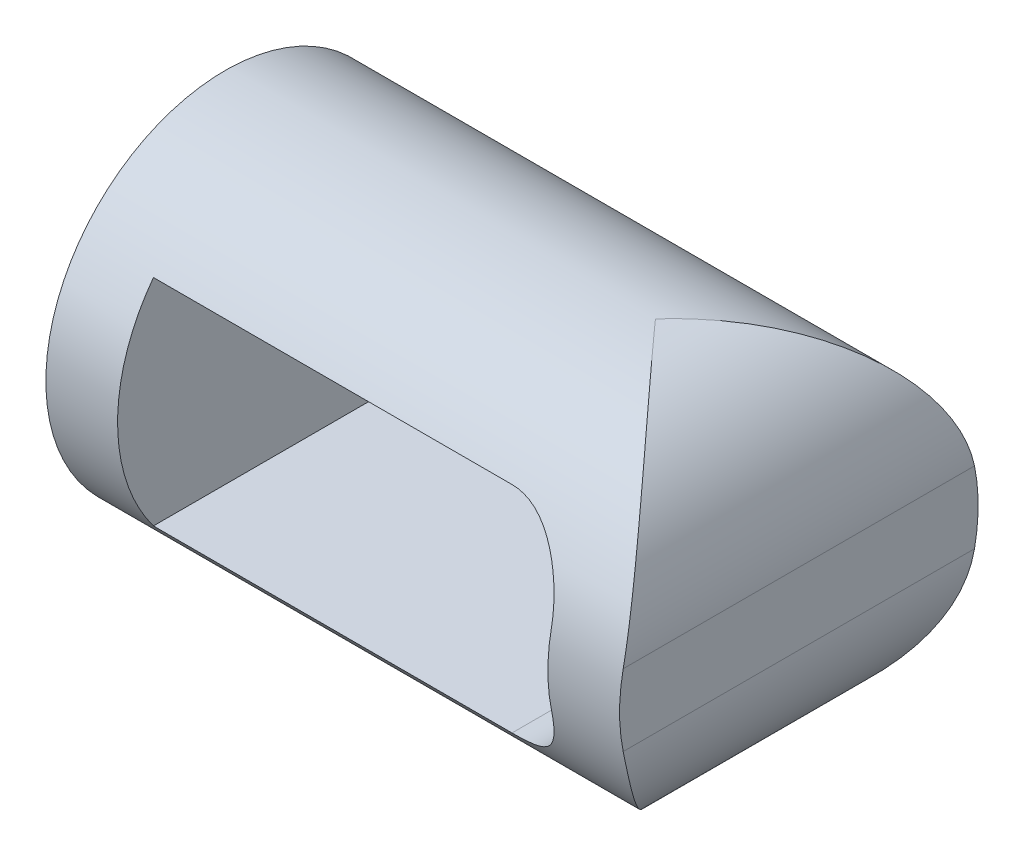
ISO-10303-21;
HEADER;
FILE_DESCRIPTION(('STEP AP214'),'2;1');
FILE_NAME('part.step','',(''),(''),'','','');
FILE_SCHEMA(('AUTOMOTIVE_DESIGN { 1 0 10303 214 1 1 1 1 }'));
ENDSEC;
DATA;
#1=APPLICATION_CONTEXT('core data for automotive mechanical design processes');
#2=APPLICATION_PROTOCOL_DEFINITION('international standard','automotive_design',2000,#1);
#3=PRODUCT_CONTEXT('',#1,'mechanical');
#4=PRODUCT('Part','Part','',(#3));
#5=PRODUCT_RELATED_PRODUCT_CATEGORY('part','',(#4));
#6=PRODUCT_DEFINITION_FORMATION('','',#4);
#7=PRODUCT_DEFINITION_CONTEXT('part definition',#1,'design');
#8=PRODUCT_DEFINITION('design','',#6,#7);
#9=PRODUCT_DEFINITION_SHAPE('','',#8);
#10=(LENGTH_UNIT() NAMED_UNIT(*) SI_UNIT(.MILLI.,.METRE.));
#11=(NAMED_UNIT(*) PLANE_ANGLE_UNIT() SI_UNIT($,.RADIAN.));
#12=(NAMED_UNIT(*) SI_UNIT($,.STERADIAN.) SOLID_ANGLE_UNIT());
#13=UNCERTAINTY_MEASURE_WITH_UNIT(LENGTH_MEASURE(1.E-05),#10,'distance_accuracy_value','');
#14=(GEOMETRIC_REPRESENTATION_CONTEXT(3) GLOBAL_UNCERTAINTY_ASSIGNED_CONTEXT((#13)) GLOBAL_UNIT_ASSIGNED_CONTEXT((#10,
#11,#12)) REPRESENTATION_CONTEXT('',''));
#15=CARTESIAN_POINT('',(0.,0.,0.));
#16=DIRECTION('',(0.,0.,1.));
#17=DIRECTION('',(1.,0.,0.));
#18=AXIS2_PLACEMENT_3D('',#15,#16,#17);
#19=CARTESIAN_POINT('',(40.,0.,0.));
#20=DIRECTION('',(-1.,0.,0.));
#21=DIRECTION('',(0.,0.,1.));
#22=AXIS2_PLACEMENT_3D('',#19,#20,#21);
#23=CYLINDRICAL_SURFACE('',#22,12.5);
#24=CARTESIAN_POINT('',(5.,0.,0.));
#25=DIRECTION('',(1.,0.,0.));
#26=DIRECTION('',(0.,0.,-1.));
#27=AXIS2_PLACEMENT_3D('',#24,#25,#26);
#28=CIRCLE('',#27,12.5);
#29=CARTESIAN_POINT('',(5.,7.5,10.));
#30=VERTEX_POINT('',#29);
#31=CARTESIAN_POINT('',(5.,-7.5,10.));
#32=VERTEX_POINT('',#31);
#33=EDGE_CURVE('E175',#30,#32,#28,.T.);
#34=ORIENTED_EDGE('',*,*,#33,.F.);
#35=DIRECTION('',(-1.,0.,0.));
#36=VECTOR('',#35,1.);
#37=CARTESIAN_POINT('',(40.,7.5,10.));
#38=LINE('',#37,#36);
#39=CARTESIAN_POINT('',(30.,7.5,10.));
#40=VERTEX_POINT('',#39);
#41=EDGE_CURVE('E231',#40,#30,#38,.T.);
#42=ORIENTED_EDGE('',*,*,#41,.F.);
#43=CARTESIAN_POINT('',(35.,2.5,12.2474487139159));
#44=CARTESIAN_POINT('',(35.0000173108513,2.64304263964975,12.2182744647754));
#45=CARTESIAN_POINT('',(34.9938627064975,2.78552844624909,12.1865559325942));
#46=CARTESIAN_POINT('',(34.9696227152255,3.06826211512575,12.1184463564197));
#47=CARTESIAN_POINT('',(34.9515448286343,3.20851132756378,12.082058261392));
#48=CARTESIAN_POINT('',(34.9039861170737,3.48515633374348,12.0051751495393));
#49=CARTESIAN_POINT('',(34.8745611125683,3.62156753713345,11.9647009422692));
#50=CARTESIAN_POINT('',(34.8048088684089,3.8903633491403,11.8800237231488));
#51=CARTESIAN_POINT('',(34.7644801133342,4.02274739520904,11.8358201935794));
#52=CARTESIAN_POINT('',(34.6281028468935,4.41208190303809,11.6986689981954));
#53=CARTESIAN_POINT('',(34.5165085153691,4.66208884780586,11.6009337054515));
#54=CARTESIAN_POINT('',(34.2557979703201,5.13860273294414,11.3979020362314));
#55=CARTESIAN_POINT('',(34.1066196834968,5.36506991250965,11.2925933592719));
#56=CARTESIAN_POINT('',(33.7605348056083,5.80812739328812,11.0716644354255));
#57=CARTESIAN_POINT('',(33.5607180263125,6.02238595046168,10.9559065984226));
#58=CARTESIAN_POINT('',(33.1247091819133,6.41435144079428,10.7311301527593));
#59=CARTESIAN_POINT('',(32.8885270398023,6.59206831425582,10.6221097170072));
#60=CARTESIAN_POINT('',(32.4234488092273,6.88054775875883,10.4370799173079));
#61=CARTESIAN_POINT('',(32.1994121837499,6.99747034027596,10.3585791372034));
#62=CARTESIAN_POINT('',(31.8487374182665,7.14740003987351,10.2551623196672));
#63=CARTESIAN_POINT('',(31.7295123090405,7.19310732901987,10.2230994169672));
#64=CARTESIAN_POINT('',(31.4867004479111,7.2755766096283,10.1645729633264));
#65=CARTESIAN_POINT('',(31.3631161663763,7.31234357724589,10.1381062986118));
#66=CARTESIAN_POINT('',(31.1380549197897,7.36984845904019,10.09635201108));
#67=CARTESIAN_POINT('',(31.0372367394838,7.39232710187402,10.0798849791753));
#68=CARTESIAN_POINT('',(30.8338116365539,7.43107241030281,10.0513550947375));
#69=CARTESIAN_POINT('',(30.731205117396,7.44734045857258,10.0392912619394));
#70=CARTESIAN_POINT('',(30.5241919408818,7.47354551079658,10.019800493881));
#71=CARTESIAN_POINT('',(30.4197786430372,7.48344866718375,10.0123983529423));
#72=CARTESIAN_POINT('',(30.2102473279902,7.49668496536224,10.0024860173858));
#73=CARTESIAN_POINT('',(30.1051289438324,7.50001436813701,9.99997860679958));
#74=CARTESIAN_POINT('',(30.,7.5,10.));
#75=B_SPLINE_CURVE_WITH_KNOTS('',3,(#43,#44,#45,#46,#47,#48,#49,#50,#51,#52,#53,#54,#55,#56,#57,
#58,#59,#60,#61,#62,#63,#64,#65,#66,#67,#68,#69,#70,#71,#72,#73,#74),.UNSPECIFIED.,.F.,.F.,(4,2,
2,2,2,2,2,2,2,2,2,2,2,2,2,4),(0.,0.437753426293644,0.875231746594388,1.31058485962215,
1.74599850985513,2.61409497073356,3.4836346795091,4.42445953030344,5.36502811232595,
6.1553956877774,6.54993683038406,6.94425786733992,7.25778238313815,7.57123705769995,
7.88634514009734,8.20163239795346),.UNSPECIFIED.);
#76=CARTESIAN_POINT('',(35.,2.5,12.2474487139159));
#77=VERTEX_POINT('',#76);
#78=EDGE_CURVE('E225',#77,#40,#75,.T.);
#79=ORIENTED_EDGE('',*,*,#78,.F.);
#80=CARTESIAN_POINT('',(35.,0.,0.));
#81=DIRECTION('',(-1.,0.,0.));
#82=DIRECTION('',(0.,0.,1.));
#83=AXIS2_PLACEMENT_3D('',#80,#81,#82);
#84=CIRCLE('',#83,12.5);
#85=CARTESIAN_POINT('',(35.,-2.49999999999997,12.2474487139159));
#86=VERTEX_POINT('',#85);
#87=EDGE_CURVE('E171',#86,#77,#84,.T.);
#88=ORIENTED_EDGE('',*,*,#87,.F.);
#89=CARTESIAN_POINT('',(35.,-2.49999999999997,12.2474487139159));
#90=CARTESIAN_POINT('',(35.0000173108513,-2.64304263964971,12.2182744647754));
#91=CARTESIAN_POINT('',(34.9938627064975,-2.78552844624906,12.1865559325942));
#92=CARTESIAN_POINT('',(34.9696227152255,-3.06826211512571,12.1184463564197));
#93=CARTESIAN_POINT('',(34.9515448286343,-3.20851132756375,12.082058261392));
#94=CARTESIAN_POINT('',(34.9039861170737,-3.48515633374345,12.0051751495393));
#95=CARTESIAN_POINT('',(34.8745611125683,-3.62156753713341,11.9647009422692));
#96=CARTESIAN_POINT('',(34.804808868409,-3.89036334914026,11.8800237231489));
#97=CARTESIAN_POINT('',(34.7644801133343,-4.022747395209,11.8358201935794));
#98=CARTESIAN_POINT('',(34.6281028468935,-4.41208190303806,11.6986689981954));
#99=CARTESIAN_POINT('',(34.5165085153691,-4.66208884780584,11.6009337054515));
#100=CARTESIAN_POINT('',(34.2557979703202,-5.13860273294411,11.3979020362315));
#101=CARTESIAN_POINT('',(34.1066196834968,-5.36506991250962,11.292593359272));
#102=CARTESIAN_POINT('',(33.7605348056084,-5.8081273932881,11.0716644354255));
#103=CARTESIAN_POINT('',(33.5607180263126,-6.02238595046165,10.9559065984226));
#104=CARTESIAN_POINT('',(33.1247091819133,-6.41435144079425,10.7311301527593));
#105=CARTESIAN_POINT('',(32.8885270398023,-6.5920683142558,10.6221097170072));
#106=CARTESIAN_POINT('',(32.4234488092274,-6.88054775875881,10.4370799173079));
#107=CARTESIAN_POINT('',(32.19941218375,-6.99747034027594,10.3585791372034));
#108=CARTESIAN_POINT('',(31.8487374182665,-7.1474000398735,10.2551623196672));
#109=CARTESIAN_POINT('',(31.7295123090405,-7.19310732901985,10.2230994169672));
#110=CARTESIAN_POINT('',(31.4867004479111,-7.27557660962829,10.1645729633264));
#111=CARTESIAN_POINT('',(31.3631161663764,-7.31234357724588,10.1381062986118));
#112=CARTESIAN_POINT('',(31.1380549197897,-7.36984845904019,10.09635201108));
#113=CARTESIAN_POINT('',(31.0372367394838,-7.39232710187401,10.0798849791753));
#114=CARTESIAN_POINT('',(30.8338116365539,-7.4310724103028,10.0513550947375));
#115=CARTESIAN_POINT('',(30.731205117396,-7.44734045857258,10.0392912619394));
#116=CARTESIAN_POINT('',(30.5241919408818,-7.47354551079658,10.019800493881));
#117=CARTESIAN_POINT('',(30.4197786430372,-7.48344866718375,10.0123983529423));
#118=CARTESIAN_POINT('',(30.2102473279901,-7.49668496536224,10.0024860173858));
#119=CARTESIAN_POINT('',(30.1051289438324,-7.50001436813701,9.99997860679958));
#120=CARTESIAN_POINT('',(30.,-7.5,10.));
#121=B_SPLINE_CURVE_WITH_KNOTS('',3,(#89,#90,#91,#92,#93,#94,#95,#96,#97,#98,#99,#100,#101,#102,
#103,#104,#105,#106,#107,#108,#109,#110,#111,#112,#113,#114,#115,#116,#117,#118,#119,#120),
.UNSPECIFIED.,.F.,.F.,(4,2,2,2,2,2,2,2,2,2,2,2,2,2,2,4),(0.,0.437753426293642,0.875231746594384,
1.31058485962215,1.74599850985513,2.61409497073357,3.48363467950909,4.42445953030343,
5.36502811232594,6.15539568777739,6.54993683038405,6.94425786733991,7.25778238313816,
7.57123705769998,7.8863451400974,8.20163239795353),.UNSPECIFIED.);
#122=CARTESIAN_POINT('',(30.,-7.5,10.));
#123=VERTEX_POINT('',#122);
#124=EDGE_CURVE('E183',#86,#123,#121,.T.);
#125=ORIENTED_EDGE('',*,*,#124,.T.);
#126=DIRECTION('',(-1.,0.,0.));
#127=VECTOR('',#126,1.);
#128=CARTESIAN_POINT('',(40.,-7.5,10.));
#129=LINE('',#128,#127);
#130=EDGE_CURVE('E179',#123,#32,#129,.T.);
#131=ORIENTED_EDGE('',*,*,#130,.T.);
#132=EDGE_LOOP('',(#34,#42,#79,#88,#125,#131));
#133=FACE_BOUND('',#132,.T.);
#134=CARTESIAN_POINT('',(0.,0.,0.));
#135=DIRECTION('',(1.,0.,0.));
#136=DIRECTION('',(0.,0.,-1.));
#137=AXIS2_PLACEMENT_3D('',#134,#135,#136);
#138=CIRCLE('',#137,12.5);
#139=CARTESIAN_POINT('',(0.,0.,-12.5));
#140=VERTEX_POINT('',#139);
#141=EDGE_CURVE('E155',#140,#140,#138,.T.);
#142=ORIENTED_EDGE('',*,*,#141,.T.);
#143=EDGE_LOOP('',(#142));
#144=FACE_BOUND('',#143,.T.);
#145=DIRECTION('',(-1.,0.,0.));
#146=VECTOR('',#145,1.);
#147=CARTESIAN_POINT('',(40.,7.5,-10.));
#148=LINE('',#147,#146);
#149=CARTESIAN_POINT('',(5.,7.5,-10.));
#150=VERTEX_POINT('',#149);
#151=CARTESIAN_POINT('',(30.,7.5,-10.));
#152=VERTEX_POINT('',#151);
#153=EDGE_CURVE('E217',#150,#152,#148,.F.);
#154=ORIENTED_EDGE('',*,*,#153,.F.);
#155=CARTESIAN_POINT('',(5.,-7.5,-10.));
#156=VERTEX_POINT('',#155);
#157=EDGE_CURVE('E180',#156,#150,#28,.T.);
#158=ORIENTED_EDGE('',*,*,#157,.F.);
#159=DIRECTION('',(-1.,0.,0.));
#160=VECTOR('',#159,1.);
#161=CARTESIAN_POINT('',(40.,-7.5,-10.));
#162=LINE('',#161,#160);
#163=CARTESIAN_POINT('',(30.,-7.5,-10.));
#164=VERTEX_POINT('',#163);
#165=EDGE_CURVE('E191',#156,#164,#162,.F.);
#166=ORIENTED_EDGE('',*,*,#165,.T.);
#167=CARTESIAN_POINT('',(30.,-7.5,-10.));
#168=CARTESIAN_POINT('',(30.1247204693742,-7.50002718708944,-9.99995899400171));
#169=CARTESIAN_POINT('',(30.2494152129274,-7.49533447378452,-10.0034987559836));
#170=CARTESIAN_POINT('',(30.4976304337379,-7.47672263245428,-10.0174279416072));
#171=CARTESIAN_POINT('',(30.6211517837259,-7.46281101308754,-10.0278117908072));
#172=CARTESIAN_POINT('',(30.8651870607509,-7.42611195382512,-10.0550160327823));
#173=CARTESIAN_POINT('',(30.9857165766035,-7.40339171760391,-10.0717876744305));
#174=CARTESIAN_POINT('',(31.2238543588848,-7.3494435771701,-10.1112212887111));
#175=CARTESIAN_POINT('',(31.3414621628741,-7.31821433542279,-10.1338841873673));
#176=CARTESIAN_POINT('',(31.6880630063489,-7.21259470087898,-10.2096031889185));
#177=CARTESIAN_POINT('',(31.9117927579268,-7.12612369339366,-10.2705047596072));
#178=CARTESIAN_POINT('',(32.3410770407231,-6.92446188467155,-10.4075281418579));
#179=CARTESIAN_POINT('',(32.5465949241225,-6.80921487920687,-10.4836796807873));
#180=CARTESIAN_POINT('',(32.9579899574613,-6.5394483316558,-10.6542826991711));
#181=CARTESIAN_POINT('',(33.1615107031403,-6.38203223564422,-10.7498222582702));
#182=CARTESIAN_POINT('',(33.5409575749913,-6.03935031693989,-10.9460127206075));
#183=CARTESIAN_POINT('',(33.7168677433811,-5.85406850924902,-11.0466665355199));
#184=CARTESIAN_POINT('',(33.9709467976543,-5.54194198186121,-11.2050638316715));
#185=CARTESIAN_POINT('',(34.0591353515685,-5.42323956627597,-11.2630733904142));
#186=CARTESIAN_POINT('',(34.2248904373856,-5.17809212682015,-11.3778578260909));
#187=CARTESIAN_POINT('',(34.3024602110048,-5.05164948303285,-11.4346330753644));
#188=CARTESIAN_POINT('',(34.4463559691219,-4.79171870985679,-11.5459696717059));
#189=CARTESIAN_POINT('',(34.5126892655615,-4.65823523691382,-11.6005324407848));
#190=CARTESIAN_POINT('',(34.6335097103042,-4.38491258464052,-11.7065797246787));
#191=CARTESIAN_POINT('',(34.6880031238864,-4.24507681433904,-11.7580658570405));
#192=CARTESIAN_POINT('',(34.779067644612,-3.97592597750572,-11.8515805156562));
#193=CARTESIAN_POINT('',(34.8169667022358,-3.84720222848403,-11.8940208810842));
#194=CARTESIAN_POINT('',(34.8824729141968,-3.58608179285811,-11.9753379007698));
#195=CARTESIAN_POINT('',(34.9100822264228,-3.45368588261661,-12.0142153009349));
#196=CARTESIAN_POINT('',(34.9546507101497,-3.18553472687917,-12.0880822999534));
#197=CARTESIAN_POINT('',(34.9715730096907,-3.04976951260877,-12.1230580996838));
#198=CARTESIAN_POINT('',(34.994259358269,-2.77617557228172,-12.1886338213263));
#199=CARTESIAN_POINT('',(35.0000161939026,-2.63834557017233,-12.219230902572));
#200=CARTESIAN_POINT('',(35.,-2.49999999999997,-12.2474487139159));
#201=B_SPLINE_CURVE_WITH_KNOTS('',3,(#167,#168,#169,#170,#171,#172,#173,#174,#175,#176,#177,
#178,#179,#180,#181,#182,#183,#184,#185,#186,#187,#188,#189,#190,#191,#192,#193,#194,#195,#196,
#197,#198,#199,#200),.UNSPECIFIED.,.F.,.F.,(4,2,2,2,2,2,2,2,2,2,2,2,2,2,2,2,4),(0.,
0.373981117624396,0.747658007090969,1.11853838755862,1.48947710055967,2.2284595050888,
2.96889671075211,3.78926824402105,4.61011218624194,5.08618334638943,5.56210884518987,
6.03772344402542,6.51308574686093,6.93485421040295,7.35653417396105,7.77966116721225,
8.20306142904119),.UNSPECIFIED.);
#202=CARTESIAN_POINT('',(35.,-2.49999999999997,-12.2474487139159));
#203=VERTEX_POINT('',#202);
#204=EDGE_CURVE('E203',#164,#203,#201,.T.);
#205=ORIENTED_EDGE('',*,*,#204,.T.);
#206=CARTESIAN_POINT('',(35.,2.5,-12.2474487139159));
#207=VERTEX_POINT('',#206);
#208=EDGE_CURVE('E176',#207,#203,#84,.T.);
#209=ORIENTED_EDGE('',*,*,#208,.F.);
#210=CARTESIAN_POINT('',(30.,7.5,-10.));
#211=CARTESIAN_POINT('',(30.1247204693742,7.50002718708944,-9.99995899400171));
#212=CARTESIAN_POINT('',(30.2494152129274,7.49533447378452,-10.0034987559836));
#213=CARTESIAN_POINT('',(30.4976304337379,7.47672263245427,-10.0174279416072));
#214=CARTESIAN_POINT('',(30.6211517837259,7.46281101308753,-10.0278117908072));
#215=CARTESIAN_POINT('',(30.8651870607509,7.42611195382512,-10.0550160327823));
#216=CARTESIAN_POINT('',(30.9857165766035,7.4033917176039,-10.0717876744305));
#217=CARTESIAN_POINT('',(31.2238543588848,7.34944357717009,-10.1112212887111));
#218=CARTESIAN_POINT('',(31.3414621628742,7.31821433542278,-10.1338841873673));
#219=CARTESIAN_POINT('',(31.688063006349,7.21259470087896,-10.2096031889185));
#220=CARTESIAN_POINT('',(31.9117927579268,7.12612369339364,-10.2705047596073));
#221=CARTESIAN_POINT('',(32.3410770407231,6.92446188467153,-10.4075281418579));
#222=CARTESIAN_POINT('',(32.5465949241226,6.80921487920684,-10.4836796807874));
#223=CARTESIAN_POINT('',(32.9579899574613,6.53944833165577,-10.6542826991711));
#224=CARTESIAN_POINT('',(33.1615107031404,6.38203223564418,-10.7498222582702));
#225=CARTESIAN_POINT('',(33.5409575749913,6.03935031693985,-10.9460127206075));
#226=CARTESIAN_POINT('',(33.7168677433812,5.85406850924898,-11.0466665355199));
#227=CARTESIAN_POINT('',(33.9709467976543,5.54194198186117,-11.2050638316715));
#228=CARTESIAN_POINT('',(34.0591353515686,5.42323956627592,-11.2630733904142));
#229=CARTESIAN_POINT('',(34.2248904373856,5.1780921268201,-11.377857826091));
#230=CARTESIAN_POINT('',(34.3024602110048,5.0516494830328,-11.4346330753644));
#231=CARTESIAN_POINT('',(34.446355969122,4.79171870985673,-11.5459696717059));
#232=CARTESIAN_POINT('',(34.5126892655615,4.65823523691376,-11.6005324407848));
#233=CARTESIAN_POINT('',(34.6335097103043,4.38491258464045,-11.7065797246787));
#234=CARTESIAN_POINT('',(34.6880031238864,4.24507681433898,-11.7580658570405));
#235=CARTESIAN_POINT('',(34.779067644612,3.97592597750566,-11.8515805156563));
#236=CARTESIAN_POINT('',(34.8169667022359,3.84720222848398,-11.8940208810842));
#237=CARTESIAN_POINT('',(34.8824729141968,3.58608179285807,-11.9753379007698));
#238=CARTESIAN_POINT('',(34.9100822264228,3.45368588261658,-12.0142153009349));
#239=CARTESIAN_POINT('',(34.9546507101497,3.18553472687915,-12.0880822999534));
#240=CARTESIAN_POINT('',(34.9715730096907,3.04976951260877,-12.1230580996838));
#241=CARTESIAN_POINT('',(34.994259358269,2.77617557228174,-12.1886338213263));
#242=CARTESIAN_POINT('',(35.0000161939026,2.63834557017235,-12.219230902572));
#243=CARTESIAN_POINT('',(35.,2.5,-12.2474487139159));
#244=B_SPLINE_CURVE_WITH_KNOTS('',3,(#210,#211,#212,#213,#214,#215,#216,#217,#218,#219,#220,
#221,#222,#223,#224,#225,#226,#227,#228,#229,#230,#231,#232,#233,#234,#235,#236,#237,#238,#239,
#240,#241,#242,#243),.UNSPECIFIED.,.F.,.F.,(4,2,2,2,2,2,2,2,2,2,2,2,2,2,2,2,4),(0.,
0.373981117624393,0.747658007090967,1.11853838755862,1.48947710055968,2.22845950508881,
2.96889671075212,3.78926824402107,4.61011218624196,5.08618334638946,5.56210884518991,
6.03772344402545,6.51308574686096,6.93485421040296,7.35653417396103,7.77966116721221,
8.20306142904111),.UNSPECIFIED.);
#245=EDGE_CURVE('E210',#152,#207,#244,.T.);
#246=ORIENTED_EDGE('',*,*,#245,.F.);
#247=EDGE_LOOP('',(#154,#158,#166,#205,#209,#246));
#248=FACE_BOUND('',#247,.T.);
#249=CARTESIAN_POINT('',(40.,-2.5,12.2474487139159));
#250=CARTESIAN_POINT('',(40.0000016717614,-2.62836492800187,12.2212486348904));
#251=CARTESIAN_POINT('',(39.9975278269961,-2.75629370404988,12.1930302177246));
#252=CARTESIAN_POINT('',(39.9877477677561,-3.01101288582775,12.1326388316596));
#253=CARTESIAN_POINT('',(39.9804421282439,-3.13780342518354,12.1004663336494));
#254=CARTESIAN_POINT('',(39.9514818911527,-3.51575777321372,11.9982272566927));
#255=CARTESIAN_POINT('',(39.9227832916221,-3.76486868655985,11.9223645511743));
#256=CARTESIAN_POINT('',(39.8481892856461,-4.25318493665481,11.7569686480874));
#257=CARTESIAN_POINT('',(39.8024541455063,-4.49246020774166,11.6675673227206));
#258=CARTESIAN_POINT('',(39.6951562142992,-4.96210938665913,11.4757062960274));
#259=CARTESIAN_POINT('',(39.6335891766424,-5.19248088713104,11.3732430948384));
#260=CARTESIAN_POINT('',(39.4964384794338,-5.64207505780995,11.1570120936349));
#261=CARTESIAN_POINT('',(39.420922154275,-5.86134509784488,11.0432997695532));
#262=CARTESIAN_POINT('',(39.2571727841952,-6.28909331280023,10.8054266560405));
#263=CARTESIAN_POINT('',(39.1689407811051,-6.49757236995574,10.6812667229576));
#264=CARTESIAN_POINT('',(38.8867706392496,-7.10716904144928,10.2941716913459));
#265=CARTESIAN_POINT('',(38.6756355649242,-7.49156845696739,10.0170503175293));
#266=CARTESIAN_POINT('',(38.271497867742,-8.12937746668313,9.50210905704535));
#267=CARTESIAN_POINT('',(38.0857620030858,-8.39242141563058,9.27020937745591));
#268=CARTESIAN_POINT('',(37.6970373721113,-8.89184672809907,8.79229528446788));
#269=CARTESIAN_POINT('',(37.4940413229099,-9.12821673775368,8.54627492726254));
#270=CARTESIAN_POINT('',(37.0736373446144,-9.57516746862886,8.04237841813135));
#271=CARTESIAN_POINT('',(36.856203559486,-9.78569988767282,7.78448126408438));
#272=CARTESIAN_POINT('',(36.4098575437241,-10.1813179451211,7.25939452862124));
#273=CARTESIAN_POINT('',(36.1809455932952,-10.3664042043038,6.99220517409465));
#274=CARTESIAN_POINT('',(35.6269671243344,-10.7762372277529,6.34957093762996));
#275=CARTESIAN_POINT('',(35.2977659779117,-10.9901814552208,5.97077737702586));
#276=CARTESIAN_POINT('',(34.6262047623305,-11.3740002065139,5.20255599568804));
#277=CARTESIAN_POINT('',(34.2838388217176,-11.543854798515,4.81312345295705));
#278=CARTESIAN_POINT('',(33.5899154020178,-11.8410301489273,4.02696456262087));
#279=CARTESIAN_POINT('',(33.2383652420209,-11.9683837256222,3.63024409350597));
#280=CARTESIAN_POINT('',(32.5289514273559,-12.1820224965073,2.83178959191918));
#281=CARTESIAN_POINT('',(32.171090655308,-12.2683259625359,2.43005787187767));
#282=CARTESIAN_POINT('',(31.5135128614413,-12.3894375686048,1.693005495995));
#283=CARTESIAN_POINT('',(31.2143951664175,-12.4305540918009,1.35816144339166));
#284=CARTESIAN_POINT('',(30.6151303202857,-12.4855910336129,0.687739896521128));
#285=CARTESIAN_POINT('',(30.3149846826256,-12.4995416245891,0.352163630861815));
#286=CARTESIAN_POINT('',(30.0099380598565,-12.4999962952456,0.0111110886298165));
#287=CARTESIAN_POINT('',(30.004969018897,-12.4999999988764,0.00555553200933672));
#288=CARTESIAN_POINT('',(30.,-12.5,0.));
#289=B_SPLINE_CURVE_WITH_KNOTS('',3,(#249,#250,#251,#252,#253,#254,#255,#256,#257,#258,#259,
#260,#261,#262,#263,#264,#265,#266,#267,#268,#269,#270,#271,#272,#273,#274,#275,#276,#277,#278,
#279,#280,#281,#282,#283,#284,#285,#286,#287,#288),.UNSPECIFIED.,.F.,.F.,(4,2,2,2,2,2,2,2,2,2,2,
2,2,2,2,2,2,2,2,4),(0.,0.392950042319285,0.785853333707199,1.57054881948284,2.3480416366728,
3.12574321867387,3.8997844745557,4.67376234710201,6.22473551524199,7.41376610785693,
8.60330092202695,9.79502669478863,10.9867233893376,12.6210409334166,14.2560960299531,
15.889885638236,17.5229473473761,18.8747935132382,20.2251373670876,20.2474980496234),.UNSPECIFIED.);
#290=CARTESIAN_POINT('',(40.,-2.5,12.2474487139159));
#291=VERTEX_POINT('',#290);
#292=CARTESIAN_POINT('',(29.9999999999999,-12.5,0.));
#293=VERTEX_POINT('',#292);
#294=EDGE_CURVE('E108',#291,#293,#289,.T.);
#295=ORIENTED_EDGE('',*,*,#294,.F.);
#296=CARTESIAN_POINT('',(40.,0.,0.));
#297=DIRECTION('',(1.,0.,0.));
#298=DIRECTION('',(0.,0.,-1.));
#299=AXIS2_PLACEMENT_3D('',#296,#297,#298);
#300=CIRCLE('',#299,12.5);
#301=CARTESIAN_POINT('',(40.,2.5,12.2474487139159));
#302=VERTEX_POINT('',#301);
#303=EDGE_CURVE('E169',#302,#291,#300,.T.);
#304=ORIENTED_EDGE('',*,*,#303,.F.);
#305=CARTESIAN_POINT('',(40.,2.49999999999993,12.2474487139159));
#306=CARTESIAN_POINT('',(40.0000016717614,2.6283649280018,12.2212486348904));
#307=CARTESIAN_POINT('',(39.9975278269961,2.7562937040498,12.1930302177246));
#308=CARTESIAN_POINT('',(39.9877477677561,3.01101288582767,12.1326388316596));
#309=CARTESIAN_POINT('',(39.9804421282439,3.13780342518347,12.1004663336495));
#310=CARTESIAN_POINT('',(39.9514818911527,3.51575777321364,11.9982272566927));
#311=CARTESIAN_POINT('',(39.9227832916221,3.76486868655977,11.9223645511743));
#312=CARTESIAN_POINT('',(39.8481892856461,4.25318493665474,11.7569686480874));
#313=CARTESIAN_POINT('',(39.8024541455063,4.49246020774159,11.6675673227207));
#314=CARTESIAN_POINT('',(39.6951562142992,4.96210938665906,11.4757062960274));
#315=CARTESIAN_POINT('',(39.6335891766424,5.19248088713096,11.3732430948384));
#316=CARTESIAN_POINT('',(39.4964384794338,5.64207505780988,11.157012093635));
#317=CARTESIAN_POINT('',(39.420922154275,5.8613450978448,11.0432997695533));
#318=CARTESIAN_POINT('',(39.2571727841952,6.28909331280016,10.8054266560406));
#319=CARTESIAN_POINT('',(39.1689407811051,6.49757236995567,10.6812667229577));
#320=CARTESIAN_POINT('',(38.8867706392496,7.10716904144921,10.294171691346));
#321=CARTESIAN_POINT('',(38.6756355649242,7.49156845696732,10.0170503175294));
#322=CARTESIAN_POINT('',(38.271497867742,8.12937746668306,9.50210905704541));
#323=CARTESIAN_POINT('',(38.0857620030859,8.39242141563051,9.27020937745597));
#324=CARTESIAN_POINT('',(37.6970373721114,8.891846728099,8.79229528446795));
#325=CARTESIAN_POINT('',(37.4940413229099,9.12821673775361,8.54627492726261));
#326=CARTESIAN_POINT('',(37.0736373446145,9.57516746862879,8.04237841813143));
#327=CARTESIAN_POINT('',(36.8562035594861,9.78569988767275,7.78448126408447));
#328=CARTESIAN_POINT('',(36.4098575437242,10.1813179451211,7.25939452862133));
#329=CARTESIAN_POINT('',(36.1809455932953,10.3664042043038,6.99220517409474));
#330=CARTESIAN_POINT('',(35.6269671243345,10.7762372277528,6.34957093763006));
#331=CARTESIAN_POINT('',(35.2977659779117,10.9901814552207,5.97077737702595));
#332=CARTESIAN_POINT('',(34.6262047623306,11.3740002065138,5.20255599568815));
#333=CARTESIAN_POINT('',(34.2838388217177,11.543854798515,4.81312345295715));
#334=CARTESIAN_POINT('',(33.5899154020179,11.8410301489273,4.02696456262098));
#335=CARTESIAN_POINT('',(33.238365242021,11.9683837256222,3.63024409350608));
#336=CARTESIAN_POINT('',(32.528951427356,12.1820224965073,2.83178959191931));
#337=CARTESIAN_POINT('',(32.1710906553081,12.2683259625359,2.43005787187783));
#338=CARTESIAN_POINT('',(31.5135128614414,12.3894375686048,1.69300549599509));
#339=CARTESIAN_POINT('',(31.2143951664177,12.4305540918009,1.35816144339167));
#340=CARTESIAN_POINT('',(30.6151303202856,12.4855910336129,0.687739896521252));
#341=CARTESIAN_POINT('',(30.3149846826253,12.4995416245891,0.352163630862123));
#342=CARTESIAN_POINT('',(30.0099380598565,12.4999962952456,0.0111110886298247));
#343=CARTESIAN_POINT('',(30.004969018897,12.4999999988764,0.00555553200934091));
#344=CARTESIAN_POINT('',(30.,12.5,0.));
#345=B_SPLINE_CURVE_WITH_KNOTS('',3,(#305,#306,#307,#308,#309,#310,#311,#312,#313,#314,#315,
#316,#317,#318,#319,#320,#321,#322,#323,#324,#325,#326,#327,#328,#329,#330,#331,#332,#333,#334,
#335,#336,#337,#338,#339,#340,#341,#342,#343,#344),.UNSPECIFIED.,.F.,.F.,(4,2,2,2,2,2,2,2,2,2,2,
2,2,2,2,2,2,2,2,4),(0.,0.392950042319284,0.785853333707196,1.57054881948283,2.34804163667279,
3.12574321867385,3.89978447455568,4.673762347102,6.22473551524196,7.4137661078569,
8.6033009220269,9.79502669478857,10.9867233893375,12.6210409334165,14.256096029953,
15.8898856382359,17.522947347376,18.8747935132382,20.2251373670877,20.2474980496235),.UNSPECIFIED.);
#346=CARTESIAN_POINT('',(29.9999999999999,12.5,0.));
#347=VERTEX_POINT('',#346);
#348=EDGE_CURVE('E61',#347,#302,#345,.F.);
#349=ORIENTED_EDGE('',*,*,#348,.F.);
#350=CARTESIAN_POINT('',(40.,2.49999999999993,-12.2474487139159));
#351=CARTESIAN_POINT('',(40.0000016717614,2.6283649280018,-12.2212486348904));
#352=CARTESIAN_POINT('',(39.9975278269961,2.7562937040498,-12.1930302177246));
#353=CARTESIAN_POINT('',(39.9877477677561,3.01101288582767,-12.1326388316596));
#354=CARTESIAN_POINT('',(39.9804421282439,3.13780342518347,-12.1004663336495));
#355=CARTESIAN_POINT('',(39.9514818911527,3.51575777321364,-11.9982272566927));
#356=CARTESIAN_POINT('',(39.9227832916221,3.76486868655977,-11.9223645511743));
#357=CARTESIAN_POINT('',(39.8481892856461,4.25318493665474,-11.7569686480874));
#358=CARTESIAN_POINT('',(39.8024541455063,4.49246020774159,-11.6675673227207));
#359=CARTESIAN_POINT('',(39.6951562142992,4.96210938665906,-11.4757062960274));
#360=CARTESIAN_POINT('',(39.6335891766424,5.19248088713096,-11.3732430948384));
#361=CARTESIAN_POINT('',(39.4964384794338,5.64207505780988,-11.157012093635));
#362=CARTESIAN_POINT('',(39.420922154275,5.8613450978448,-11.0432997695533));
#363=CARTESIAN_POINT('',(39.2571727841952,6.28909331280016,-10.8054266560406));
#364=CARTESIAN_POINT('',(39.1689407811051,6.49757236995567,-10.6812667229577));
#365=CARTESIAN_POINT('',(38.8867706392496,7.10716904144921,-10.294171691346));
#366=CARTESIAN_POINT('',(38.6756355649242,7.49156845696732,-10.0170503175294));
#367=CARTESIAN_POINT('',(38.271497867742,8.12937746668306,-9.50210905704541));
#368=CARTESIAN_POINT('',(38.0857620030859,8.39242141563051,-9.27020937745597));
#369=CARTESIAN_POINT('',(37.6970373721114,8.891846728099,-8.79229528446795));
#370=CARTESIAN_POINT('',(37.4940413229099,9.12821673775361,-8.54627492726261));
#371=CARTESIAN_POINT('',(37.0736373446145,9.57516746862879,-8.04237841813143));
#372=CARTESIAN_POINT('',(36.8562035594861,9.78569988767275,-7.78448126408447));
#373=CARTESIAN_POINT('',(36.4098575437242,10.1813179451211,-7.25939452862133));
#374=CARTESIAN_POINT('',(36.1809455932953,10.3664042043038,-6.99220517409474));
#375=CARTESIAN_POINT('',(35.6269671243345,10.7762372277528,-6.34957093763006));
#376=CARTESIAN_POINT('',(35.2977659779117,10.9901814552207,-5.97077737702595));
#377=CARTESIAN_POINT('',(34.6262047623306,11.3740002065138,-5.20255599568815));
#378=CARTESIAN_POINT('',(34.2838388217177,11.543854798515,-4.81312345295715));
#379=CARTESIAN_POINT('',(33.5899154020179,11.8410301489273,-4.02696456262098));
#380=CARTESIAN_POINT('',(33.238365242021,11.9683837256222,-3.63024409350608));
#381=CARTESIAN_POINT('',(32.528951427356,12.1820224965073,-2.83178959191931));
#382=CARTESIAN_POINT('',(32.1710906553081,12.2683259625359,-2.43005787187783));
#383=CARTESIAN_POINT('',(31.5135128614414,12.3894375686048,-1.69300549599509));
#384=CARTESIAN_POINT('',(31.2143951664177,12.4305540918009,-1.35816144339167));
#385=CARTESIAN_POINT('',(30.6151303202856,12.4855910336129,-0.687739896521252));
#386=CARTESIAN_POINT('',(30.3149846826253,12.4995416245891,-0.352163630862123));
#387=CARTESIAN_POINT('',(30.0099380598565,12.4999962952456,-0.0111110886298247));
#388=CARTESIAN_POINT('',(30.004969018897,12.4999999988764,-0.00555553200934091));
#389=CARTESIAN_POINT('',(30.,12.5,0.));
#390=B_SPLINE_CURVE_WITH_KNOTS('',3,(#350,#351,#352,#353,#354,#355,#356,#357,#358,#359,#360,
#361,#362,#363,#364,#365,#366,#367,#368,#369,#370,#371,#372,#373,#374,#375,#376,#377,#378,#379,
#380,#381,#382,#383,#384,#385,#386,#387,#388,#389),.UNSPECIFIED.,.F.,.F.,(4,2,2,2,2,2,2,2,2,2,2,
2,2,2,2,2,2,2,2,4),(0.,0.392950042319284,0.785853333707196,1.57054881948283,2.34804163667279,
3.12574321867385,3.89978447455568,4.673762347102,6.22473551524196,7.4137661078569,
8.6033009220269,9.79502669478857,10.9867233893375,12.6210409334165,14.256096029953,
15.8898856382359,17.522947347376,18.8747935132382,20.2251373670877,20.2474980496235),.UNSPECIFIED.);
#391=CARTESIAN_POINT('',(40.,2.49999999999993,-12.2474487139159));
#392=VERTEX_POINT('',#391);
#393=EDGE_CURVE('E145',#392,#347,#390,.T.);
#394=ORIENTED_EDGE('',*,*,#393,.F.);
#395=CARTESIAN_POINT('',(40.,-2.5,-12.2474487139159));
#396=VERTEX_POINT('',#395);
#397=EDGE_CURVE('E116',#396,#392,#300,.T.);
#398=ORIENTED_EDGE('',*,*,#397,.F.);
#399=CARTESIAN_POINT('',(40.,-2.5,-12.2474487139159));
#400=CARTESIAN_POINT('',(40.0000016717614,-2.62836492800187,-12.2212486348904));
#401=CARTESIAN_POINT('',(39.9975278269961,-2.75629370404988,-12.1930302177246));
#402=CARTESIAN_POINT('',(39.9877477677561,-3.01101288582775,-12.1326388316596));
#403=CARTESIAN_POINT('',(39.9804421282439,-3.13780342518354,-12.1004663336494));
#404=CARTESIAN_POINT('',(39.9514818911527,-3.51575777321372,-11.9982272566927));
#405=CARTESIAN_POINT('',(39.9227832916221,-3.76486868655985,-11.9223645511743));
#406=CARTESIAN_POINT('',(39.8481892856461,-4.25318493665481,-11.7569686480874));
#407=CARTESIAN_POINT('',(39.8024541455063,-4.49246020774166,-11.6675673227206));
#408=CARTESIAN_POINT('',(39.6951562142992,-4.96210938665913,-11.4757062960274));
#409=CARTESIAN_POINT('',(39.6335891766424,-5.19248088713104,-11.3732430948384));
#410=CARTESIAN_POINT('',(39.4964384794338,-5.64207505780995,-11.1570120936349));
#411=CARTESIAN_POINT('',(39.420922154275,-5.86134509784488,-11.0432997695532));
#412=CARTESIAN_POINT('',(39.2571727841952,-6.28909331280023,-10.8054266560405));
#413=CARTESIAN_POINT('',(39.1689407811051,-6.49757236995574,-10.6812667229576));
#414=CARTESIAN_POINT('',(38.8867706392496,-7.10716904144928,-10.2941716913459));
#415=CARTESIAN_POINT('',(38.6756355649242,-7.49156845696739,-10.0170503175293));
#416=CARTESIAN_POINT('',(38.271497867742,-8.12937746668313,-9.50210905704535));
#417=CARTESIAN_POINT('',(38.0857620030858,-8.39242141563058,-9.27020937745591));
#418=CARTESIAN_POINT('',(37.6970373721113,-8.89184672809907,-8.79229528446788));
#419=CARTESIAN_POINT('',(37.4940413229099,-9.12821673775368,-8.54627492726254));
#420=CARTESIAN_POINT('',(37.0736373446144,-9.57516746862886,-8.04237841813135));
#421=CARTESIAN_POINT('',(36.856203559486,-9.78569988767282,-7.78448126408438));
#422=CARTESIAN_POINT('',(36.4098575437241,-10.1813179451211,-7.25939452862124));
#423=CARTESIAN_POINT('',(36.1809455932952,-10.3664042043038,-6.99220517409465));
#424=CARTESIAN_POINT('',(35.6269671243344,-10.7762372277529,-6.34957093762996));
#425=CARTESIAN_POINT('',(35.2977659779117,-10.9901814552208,-5.97077737702586));
#426=CARTESIAN_POINT('',(34.6262047623305,-11.3740002065139,-5.20255599568804));
#427=CARTESIAN_POINT('',(34.2838388217176,-11.543854798515,-4.81312345295705));
#428=CARTESIAN_POINT('',(33.5899154020178,-11.8410301489273,-4.02696456262087));
#429=CARTESIAN_POINT('',(33.2383652420209,-11.9683837256222,-3.63024409350597));
#430=CARTESIAN_POINT('',(32.5289514273559,-12.1820224965073,-2.83178959191918));
#431=CARTESIAN_POINT('',(32.171090655308,-12.2683259625359,-2.43005787187767));
#432=CARTESIAN_POINT('',(31.5135128614413,-12.3894375686048,-1.693005495995));
#433=CARTESIAN_POINT('',(31.2143951664175,-12.4305540918009,-1.35816144339166));
#434=CARTESIAN_POINT('',(30.6151303202857,-12.4855910336129,-0.687739896521128));
#435=CARTESIAN_POINT('',(30.3149846826256,-12.4995416245891,-0.352163630861815));
#436=CARTESIAN_POINT('',(30.0099380598565,-12.4999962952456,-0.0111110886298165));
#437=CARTESIAN_POINT('',(30.004969018897,-12.4999999988764,-0.00555553200933672));
#438=CARTESIAN_POINT('',(30.,-12.5,0.));
#439=B_SPLINE_CURVE_WITH_KNOTS('',3,(#399,#400,#401,#402,#403,#404,#405,#406,#407,#408,#409,
#410,#411,#412,#413,#414,#415,#416,#417,#418,#419,#420,#421,#422,#423,#424,#425,#426,#427,#428,
#429,#430,#431,#432,#433,#434,#435,#436,#437,#438),.UNSPECIFIED.,.F.,.F.,(4,2,2,2,2,2,2,2,2,2,2,
2,2,2,2,2,2,2,2,4),(0.,0.392950042319285,0.785853333707199,1.57054881948284,2.3480416366728,
3.12574321867387,3.8997844745557,4.67376234710201,6.22473551524199,7.41376610785693,
8.60330092202695,9.79502669478863,10.9867233893376,12.6210409334166,14.2560960299531,
15.889885638236,17.5229473473761,18.8747935132382,20.2251373670876,20.2474980496234),.UNSPECIFIED.);
#440=EDGE_CURVE('E53',#293,#396,#439,.F.);
#441=ORIENTED_EDGE('',*,*,#440,.F.);
#442=EDGE_LOOP('',(#295,#304,#349,#394,#398,#441));
#443=FACE_BOUND('',#442,.T.);
#444=ADVANCED_FACE('F39',(#133,#144,#248,#443),#23,.T.);
#445=CARTESIAN_POINT('',(40.,0.,0.));
#446=DIRECTION('',(1.,0.,0.));
#447=DIRECTION('',(0.,0.,-1.));
#448=AXIS2_PLACEMENT_3D('',#445,#446,#447);
#449=PLANE('',#448);
#450=DIRECTION('',(0.,0.,1.));
#451=VECTOR('',#450,1.);
#452=CARTESIAN_POINT('',(40.,-2.5,-12.5));
#453=LINE('',#452,#451);
#454=EDGE_CURVE('E11',#396,#291,#453,.T.);
#455=ORIENTED_EDGE('',*,*,#454,.F.);
#456=ORIENTED_EDGE('',*,*,#397,.T.);
#457=DIRECTION('',(0.,0.,1.));
#458=VECTOR('',#457,1.);
#459=CARTESIAN_POINT('',(40.,2.5,-12.5));
#460=LINE('',#459,#458);
#461=EDGE_CURVE('E47',#392,#302,#460,.T.);
#462=ORIENTED_EDGE('',*,*,#461,.T.);
#463=ORIENTED_EDGE('',*,*,#303,.T.);
#464=EDGE_LOOP('',(#455,#456,#462,#463));
#465=FACE_BOUND('',#464,.T.);
#466=ADVANCED_FACE('F234',(#465),#449,.T.);
#467=CARTESIAN_POINT('',(0.,0.,0.));
#468=DIRECTION('',(1.,0.,0.));
#469=DIRECTION('',(0.,0.,-1.));
#470=AXIS2_PLACEMENT_3D('',#467,#468,#469);
#471=PLANE('',#470);
#472=ORIENTED_EDGE('',*,*,#141,.F.);
#473=EDGE_LOOP('',(#472));
#474=FACE_BOUND('',#473,.T.);
#475=ADVANCED_FACE('F236',(#474),#471,.F.);
#476=CARTESIAN_POINT('',(5.,0.,-12.5));
#477=DIRECTION('',(1.,0.,0.));
#478=DIRECTION('',(0.,0.,-1.));
#479=AXIS2_PLACEMENT_3D('',#476,#477,#478);
#480=PLANE('',#479);
#481=DIRECTION('',(0.,0.,1.));
#482=VECTOR('',#481,1.);
#483=CARTESIAN_POINT('',(5.,7.5,-12.5));
#484=LINE('',#483,#482);
#485=EDGE_CURVE('E152',#150,#30,#484,.T.);
#486=ORIENTED_EDGE('',*,*,#485,.T.);
#487=ORIENTED_EDGE('',*,*,#33,.T.);
#488=DIRECTION('',(0.,0.,1.));
#489=VECTOR('',#488,1.);
#490=CARTESIAN_POINT('',(5.,-7.5,-12.5));
#491=LINE('',#490,#489);
#492=EDGE_CURVE('E151',#156,#32,#491,.T.);
#493=ORIENTED_EDGE('',*,*,#492,.F.);
#494=ORIENTED_EDGE('',*,*,#157,.T.);
#495=EDGE_LOOP('',(#486,#487,#493,#494));
#496=FACE_BOUND('',#495,.T.);
#497=ADVANCED_FACE('F137',(#496),#480,.T.);
#498=CARTESIAN_POINT('',(5.,7.5,-12.5));
#499=DIRECTION('',(0.,-1.,0.));
#500=DIRECTION('',(1.,0.,0.));
#501=AXIS2_PLACEMENT_3D('',#498,#499,#500);
#502=PLANE('',#501);
#503=ORIENTED_EDGE('',*,*,#41,.T.);
#504=ORIENTED_EDGE('',*,*,#485,.F.);
#505=ORIENTED_EDGE('',*,*,#153,.T.);
#506=DIRECTION('',(0.,0.,1.));
#507=VECTOR('',#506,1.);
#508=CARTESIAN_POINT('',(30.,7.5,-12.5));
#509=LINE('',#508,#507);
#510=EDGE_CURVE('E156',#152,#40,#509,.T.);
#511=ORIENTED_EDGE('',*,*,#510,.T.);
#512=EDGE_LOOP('',(#503,#504,#505,#511));
#513=FACE_BOUND('',#512,.T.);
#514=ADVANCED_FACE('F222',(#513),#502,.T.);
#515=CARTESIAN_POINT('',(30.,2.5,-12.5));
#516=DIRECTION('',(0.,0.,1.));
#517=DIRECTION('',(1.,0.,0.));
#518=AXIS2_PLACEMENT_3D('',#515,#516,#517);
#519=CYLINDRICAL_SURFACE('',#518,5.);
#520=ORIENTED_EDGE('',*,*,#245,.T.);
#521=DIRECTION('',(0.,0.,1.));
#522=VECTOR('',#521,1.);
#523=CARTESIAN_POINT('',(35.,2.5,-12.5));
#524=LINE('',#523,#522);
#525=EDGE_CURVE('E159',#207,#77,#524,.T.);
#526=ORIENTED_EDGE('',*,*,#525,.T.);
#527=ORIENTED_EDGE('',*,*,#78,.T.);
#528=ORIENTED_EDGE('',*,*,#510,.F.);
#529=EDGE_LOOP('',(#520,#526,#527,#528));
#530=FACE_BOUND('',#529,.T.);
#531=ADVANCED_FACE('F219',(#530),#519,.F.);
#532=CARTESIAN_POINT('',(35.,2.5,-12.5));
#533=DIRECTION('',(-1.,0.,0.));
#534=DIRECTION('',(0.,0.,1.));
#535=AXIS2_PLACEMENT_3D('',#532,#533,#534);
#536=PLANE('',#535);
#537=ORIENTED_EDGE('',*,*,#525,.F.);
#538=ORIENTED_EDGE('',*,*,#208,.T.);
#539=DIRECTION('',(0.,0.,1.));
#540=VECTOR('',#539,1.);
#541=CARTESIAN_POINT('',(35.,-2.49999999999997,-12.5));
#542=LINE('',#541,#540);
#543=EDGE_CURVE('E162',#203,#86,#542,.T.);
#544=ORIENTED_EDGE('',*,*,#543,.T.);
#545=ORIENTED_EDGE('',*,*,#87,.T.);
#546=EDGE_LOOP('',(#537,#538,#544,#545));
#547=FACE_BOUND('',#546,.T.);
#548=ADVANCED_FACE('F198',(#547),#536,.T.);
#549=CARTESIAN_POINT('',(30.,-2.5,-12.5));
#550=DIRECTION('',(0.,0.,1.));
#551=DIRECTION('',(1.,0.,0.));
#552=AXIS2_PLACEMENT_3D('',#549,#550,#551);
#553=CYLINDRICAL_SURFACE('',#552,5.);
#554=ORIENTED_EDGE('',*,*,#543,.F.);
#555=ORIENTED_EDGE('',*,*,#204,.F.);
#556=DIRECTION('',(0.,0.,1.));
#557=VECTOR('',#556,1.);
#558=CARTESIAN_POINT('',(30.,-7.5,-12.5));
#559=LINE('',#558,#557);
#560=EDGE_CURVE('E165',#164,#123,#559,.T.);
#561=ORIENTED_EDGE('',*,*,#560,.T.);
#562=ORIENTED_EDGE('',*,*,#124,.F.);
#563=EDGE_LOOP('',(#554,#555,#561,#562));
#564=FACE_BOUND('',#563,.T.);
#565=ADVANCED_FACE('F193',(#564),#553,.F.);
#566=CARTESIAN_POINT('',(5.,-7.5,-12.5));
#567=DIRECTION('',(0.,-1.,0.));
#568=DIRECTION('',(0.,0.,-1.));
#569=AXIS2_PLACEMENT_3D('',#566,#567,#568);
#570=PLANE('',#569);
#571=ORIENTED_EDGE('',*,*,#560,.F.);
#572=ORIENTED_EDGE('',*,*,#165,.F.);
#573=ORIENTED_EDGE('',*,*,#492,.T.);
#574=ORIENTED_EDGE('',*,*,#130,.F.);
#575=EDGE_LOOP('',(#571,#572,#573,#574));
#576=FACE_BOUND('',#575,.T.);
#577=ADVANCED_FACE('F136',(#576),#570,.F.);
#578=CARTESIAN_POINT('',(30.,2.5,-12.5));
#579=DIRECTION('',(0.,0.,1.));
#580=DIRECTION('',(1.,0.,0.));
#581=AXIS2_PLACEMENT_3D('',#578,#579,#580);
#582=CYLINDRICAL_SURFACE('',#581,10.);
#583=ORIENTED_EDGE('',*,*,#393,.T.);
#584=ORIENTED_EDGE('',*,*,#348,.T.);
#585=ORIENTED_EDGE('',*,*,#461,.F.);
#586=EDGE_LOOP('',(#583,#584,#585));
#587=FACE_BOUND('',#586,.T.);
#588=ADVANCED_FACE('F131',(#587),#582,.T.);
#589=CARTESIAN_POINT('',(30.,-2.5,-12.5));
#590=DIRECTION('',(0.,0.,1.));
#591=DIRECTION('',(1.,0.,0.));
#592=AXIS2_PLACEMENT_3D('',#589,#590,#591);
#593=CYLINDRICAL_SURFACE('',#592,10.);
#594=ORIENTED_EDGE('',*,*,#294,.T.);
#595=ORIENTED_EDGE('',*,*,#440,.T.);
#596=ORIENTED_EDGE('',*,*,#454,.T.);
#597=EDGE_LOOP('',(#594,#595,#596));
#598=FACE_BOUND('',#597,.T.);
#599=ADVANCED_FACE('F109',(#598),#593,.T.);
#600=CLOSED_SHELL('',(#444,#466,#475,#497,#514,#531,#548,#565,#577,#588,#599));
#601=MANIFOLD_SOLID_BREP('B2',#600);
#602=ADVANCED_BREP_SHAPE_REPRESENTATION('',(#18,#601),#14);
#603=SHAPE_DEFINITION_REPRESENTATION(#9,#602);
ENDSEC;
END-ISO-10303-21;
